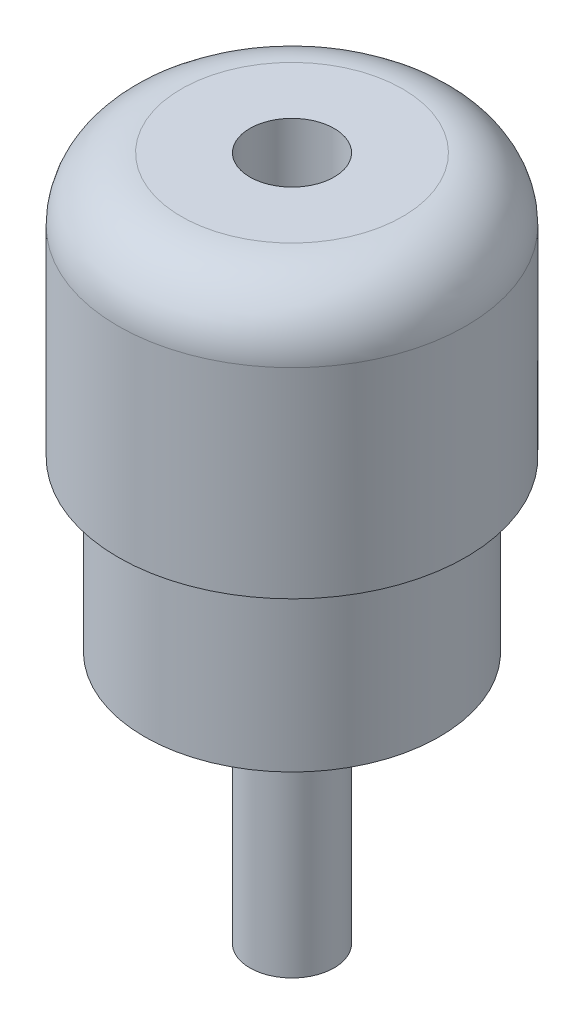
ISO-10303-21;
HEADER;
FILE_DESCRIPTION(('STEP AP214'),'2;1');
FILE_NAME('part.step','',(''),(''),'','','');
FILE_SCHEMA(('AUTOMOTIVE_DESIGN { 1 0 10303 214 1 1 1 1 }'));
ENDSEC;
DATA;
#1=APPLICATION_CONTEXT('core data for automotive mechanical design processes');
#2=APPLICATION_PROTOCOL_DEFINITION('international standard','automotive_design',2000,#1);
#3=PRODUCT_CONTEXT('',#1,'mechanical');
#4=PRODUCT('Part','Part','',(#3));
#5=PRODUCT_RELATED_PRODUCT_CATEGORY('part','',(#4));
#6=PRODUCT_DEFINITION_FORMATION('','',#4);
#7=PRODUCT_DEFINITION_CONTEXT('part definition',#1,'design');
#8=PRODUCT_DEFINITION('design','',#6,#7);
#9=PRODUCT_DEFINITION_SHAPE('','',#8);
#10=(LENGTH_UNIT() NAMED_UNIT(*) SI_UNIT(.MILLI.,.METRE.));
#11=(NAMED_UNIT(*) PLANE_ANGLE_UNIT() SI_UNIT($,.RADIAN.));
#12=(NAMED_UNIT(*) SI_UNIT($,.STERADIAN.) SOLID_ANGLE_UNIT());
#13=UNCERTAINTY_MEASURE_WITH_UNIT(LENGTH_MEASURE(1.E-05),#10,'distance_accuracy_value','');
#14=(GEOMETRIC_REPRESENTATION_CONTEXT(3) GLOBAL_UNCERTAINTY_ASSIGNED_CONTEXT((#13)) GLOBAL_UNIT_ASSIGNED_CONTEXT((#10,
#11,#12)) REPRESENTATION_CONTEXT('',''));
#15=CARTESIAN_POINT('',(0.,0.,0.));
#16=DIRECTION('',(0.,0.,1.));
#17=DIRECTION('',(1.,0.,0.));
#18=AXIS2_PLACEMENT_3D('',#15,#16,#17);
#19=CARTESIAN_POINT('',(0.,0.,0.));
#20=DIRECTION('',(0.,1.,0.));
#21=DIRECTION('',(0.,0.,1.));
#22=AXIS2_PLACEMENT_3D('',#19,#20,#21);
#23=PLANE('',#22);
#24=CARTESIAN_POINT('',(0.,0.,0.));
#25=DIRECTION('',(0.,1.,0.));
#26=DIRECTION('',(0.,0.,1.));
#27=AXIS2_PLACEMENT_3D('',#24,#25,#26);
#28=CIRCLE('',#27,2.);
#29=CARTESIAN_POINT('',(0.,0.,2.));
#30=VERTEX_POINT('',#29);
#31=EDGE_CURVE('E50',#30,#30,#28,.T.);
#32=ORIENTED_EDGE('',*,*,#31,.F.);
#33=EDGE_LOOP('',(#32));
#34=FACE_BOUND('',#33,.T.);
#35=ADVANCED_FACE('F39',(#34),#23,.F.);
#36=CARTESIAN_POINT('',(0.,32.5,0.));
#37=DIRECTION('',(0.,1.,0.));
#38=DIRECTION('',(0.,0.,1.));
#39=AXIS2_PLACEMENT_3D('',#36,#37,#38);
#40=CYLINDRICAL_SURFACE('',#39,2.);
#41=CARTESIAN_POINT('',(0.,12.,0.));
#42=DIRECTION('',(0.,1.,0.));
#43=DIRECTION('',(0.,0.,1.));
#44=AXIS2_PLACEMENT_3D('',#41,#42,#43);
#45=CIRCLE('',#44,2.);
#46=CARTESIAN_POINT('',(0.,12.,2.));
#47=VERTEX_POINT('',#46);
#48=EDGE_CURVE('E54',#47,#47,#45,.T.);
#49=ORIENTED_EDGE('',*,*,#48,.F.);
#50=EDGE_LOOP('',(#49));
#51=FACE_BOUND('',#50,.T.);
#52=ORIENTED_EDGE('',*,*,#31,.T.);
#53=EDGE_LOOP('',(#52));
#54=FACE_BOUND('',#53,.T.);
#55=ADVANCED_FACE('F94',(#51,#54),#40,.T.);
#56=CARTESIAN_POINT('',(2.,12.,0.));
#57=DIRECTION('',(0.,1.,0.));
#58=DIRECTION('',(0.,0.,1.));
#59=AXIS2_PLACEMENT_3D('',#56,#57,#58);
#60=PLANE('',#59);
#61=CARTESIAN_POINT('',(0.,12.,0.));
#62=DIRECTION('',(0.,1.,0.));
#63=DIRECTION('',(0.,0.,1.));
#64=AXIS2_PLACEMENT_3D('',#61,#62,#63);
#65=CIRCLE('',#64,7.);
#66=CARTESIAN_POINT('',(0.,12.,7.));
#67=VERTEX_POINT('',#66);
#68=EDGE_CURVE('E59',#67,#67,#65,.T.);
#69=ORIENTED_EDGE('',*,*,#68,.F.);
#70=EDGE_LOOP('',(#69));
#71=FACE_BOUND('',#70,.T.);
#72=ORIENTED_EDGE('',*,*,#48,.T.);
#73=EDGE_LOOP('',(#72));
#74=FACE_BOUND('',#73,.T.);
#75=ADVANCED_FACE('F99',(#71,#74),#60,.F.);
#76=CARTESIAN_POINT('',(0.,32.5,0.));
#77=DIRECTION('',(0.,1.,0.));
#78=DIRECTION('',(0.,0.,1.));
#79=AXIS2_PLACEMENT_3D('',#76,#77,#78);
#80=CYLINDRICAL_SURFACE('',#79,7.);
#81=CARTESIAN_POINT('',(0.,20.,0.));
#82=DIRECTION('',(0.,1.,0.));
#83=DIRECTION('',(0.,0.,1.));
#84=AXIS2_PLACEMENT_3D('',#81,#82,#83);
#85=CIRCLE('',#84,7.);
#86=CARTESIAN_POINT('',(0.,20.,7.));
#87=VERTEX_POINT('',#86);
#88=EDGE_CURVE('E62',#87,#87,#85,.T.);
#89=ORIENTED_EDGE('',*,*,#88,.F.);
#90=EDGE_LOOP('',(#89));
#91=FACE_BOUND('',#90,.T.);
#92=ORIENTED_EDGE('',*,*,#68,.T.);
#93=EDGE_LOOP('',(#92));
#94=FACE_BOUND('',#93,.T.);
#95=ADVANCED_FACE('F106',(#91,#94),#80,.T.);
#96=CARTESIAN_POINT('',(7.,20.,0.));
#97=DIRECTION('',(0.,1.,0.));
#98=DIRECTION('',(0.,0.,1.));
#99=AXIS2_PLACEMENT_3D('',#96,#97,#98);
#100=PLANE('',#99);
#101=CARTESIAN_POINT('',(0.,20.,0.));
#102=DIRECTION('',(0.,1.,0.));
#103=DIRECTION('',(0.,0.,1.));
#104=AXIS2_PLACEMENT_3D('',#101,#102,#103);
#105=CIRCLE('',#104,8.25);
#106=CARTESIAN_POINT('',(0.,20.,8.25));
#107=VERTEX_POINT('',#106);
#108=EDGE_CURVE('E65',#107,#107,#105,.T.);
#109=ORIENTED_EDGE('',*,*,#108,.F.);
#110=EDGE_LOOP('',(#109));
#111=FACE_BOUND('',#110,.T.);
#112=ORIENTED_EDGE('',*,*,#88,.T.);
#113=EDGE_LOOP('',(#112));
#114=FACE_BOUND('',#113,.T.);
#115=ADVANCED_FACE('F91',(#111,#114),#100,.F.);
#116=CARTESIAN_POINT('',(0.,32.5,0.));
#117=DIRECTION('',(0.,1.,0.));
#118=DIRECTION('',(0.,0.,1.));
#119=AXIS2_PLACEMENT_3D('',#116,#117,#118);
#120=CYLINDRICAL_SURFACE('',#119,8.25);
#121=CARTESIAN_POINT('',(0.,29.5,0.));
#122=DIRECTION('',(0.,-1.,0.));
#123=DIRECTION('',(0.,0.,-1.));
#124=AXIS2_PLACEMENT_3D('',#121,#122,#123);
#125=CIRCLE('',#124,8.25);
#126=CARTESIAN_POINT('',(0.,29.5,-8.25));
#127=VERTEX_POINT('',#126);
#128=EDGE_CURVE('E10',#127,#127,#125,.T.);
#129=ORIENTED_EDGE('',*,*,#128,.T.);
#130=EDGE_LOOP('',(#129));
#131=FACE_BOUND('',#130,.T.);
#132=ORIENTED_EDGE('',*,*,#108,.T.);
#133=EDGE_LOOP('',(#132));
#134=FACE_BOUND('',#133,.T.);
#135=ADVANCED_FACE('F85',(#131,#134),#120,.T.);
#136=CARTESIAN_POINT('',(8.25,32.5,0.));
#137=DIRECTION('',(0.,-1.,0.));
#138=DIRECTION('',(0.,0.,-1.));
#139=AXIS2_PLACEMENT_3D('',#136,#137,#138);
#140=PLANE('',#139);
#141=CARTESIAN_POINT('',(0.,32.5,0.));
#142=DIRECTION('',(0.,-1.,0.));
#143=DIRECTION('',(0.,0.,-1.));
#144=AXIS2_PLACEMENT_3D('',#141,#142,#143);
#145=CIRCLE('',#144,5.25);
#146=CARTESIAN_POINT('',(0.,32.5,-5.25));
#147=VERTEX_POINT('',#146);
#148=EDGE_CURVE('E46',#147,#147,#145,.F.);
#149=ORIENTED_EDGE('',*,*,#148,.T.);
#150=EDGE_LOOP('',(#149));
#151=FACE_BOUND('',#150,.T.);
#152=CARTESIAN_POINT('',(0.,32.5,0.));
#153=DIRECTION('',(0.,1.,0.));
#154=DIRECTION('',(0.,0.,1.));
#155=AXIS2_PLACEMENT_3D('',#152,#153,#154);
#156=CIRCLE('',#155,2.);
#157=CARTESIAN_POINT('',(0.,32.5,2.));
#158=VERTEX_POINT('',#157);
#159=EDGE_CURVE('E69',#158,#158,#156,.T.);
#160=ORIENTED_EDGE('',*,*,#159,.F.);
#161=EDGE_LOOP('',(#160));
#162=FACE_BOUND('',#161,.T.);
#163=ADVANCED_FACE('F80',(#151,#162),#140,.F.);
#164=CARTESIAN_POINT('',(0.,22.5,0.));
#165=DIRECTION('',(0.,1.,0.));
#166=DIRECTION('',(0.,0.,1.));
#167=AXIS2_PLACEMENT_3D('',#164,#165,#166);
#168=CYLINDRICAL_SURFACE('',#167,2.);
#169=CARTESIAN_POINT('',(0.,22.5,0.));
#170=DIRECTION('',(0.,1.,0.));
#171=DIRECTION('',(0.,0.,1.));
#172=AXIS2_PLACEMENT_3D('',#169,#170,#171);
#173=CIRCLE('',#172,2.);
#174=CARTESIAN_POINT('',(0.,22.5,2.));
#175=VERTEX_POINT('',#174);
#176=EDGE_CURVE('E68',#175,#175,#173,.T.);
#177=ORIENTED_EDGE('',*,*,#176,.F.);
#178=EDGE_LOOP('',(#177));
#179=FACE_BOUND('',#178,.T.);
#180=ORIENTED_EDGE('',*,*,#159,.T.);
#181=EDGE_LOOP('',(#180));
#182=FACE_BOUND('',#181,.T.);
#183=ADVANCED_FACE('F77',(#179,#182),#168,.F.);
#184=CARTESIAN_POINT('',(0.,22.5,0.));
#185=DIRECTION('',(0.,1.,0.));
#186=DIRECTION('',(0.,0.,1.));
#187=AXIS2_PLACEMENT_3D('',#184,#185,#186);
#188=PLANE('',#187);
#189=ORIENTED_EDGE('',*,*,#176,.T.);
#190=EDGE_LOOP('',(#189));
#191=FACE_BOUND('',#190,.T.);
#192=ADVANCED_FACE('F75',(#191),#188,.T.);
#193=CARTESIAN_POINT('',(0.,29.5,0.));
#194=DIRECTION('',(0.,-1.,0.));
#195=DIRECTION('',(0.,0.,-1.));
#196=AXIS2_PLACEMENT_3D('',#193,#194,#195);
#197=TOROIDAL_SURFACE('',#196,5.25,3.);
#198=ORIENTED_EDGE('',*,*,#128,.F.);
#199=EDGE_LOOP('',(#198));
#200=FACE_BOUND('',#199,.T.);
#201=ORIENTED_EDGE('',*,*,#148,.F.);
#202=EDGE_LOOP('',(#201));
#203=FACE_BOUND('',#202,.T.);
#204=ADVANCED_FACE('F41',(#200,#203),#197,.T.);
#205=CLOSED_SHELL('',(#35,#55,#75,#95,#115,#135,#163,#183,#192,#204));
#206=MANIFOLD_SOLID_BREP('B2',#205);
#207=ADVANCED_BREP_SHAPE_REPRESENTATION('',(#18,#206),#14);
#208=SHAPE_DEFINITION_REPRESENTATION(#9,#207);
ENDSEC;
END-ISO-10303-21;
